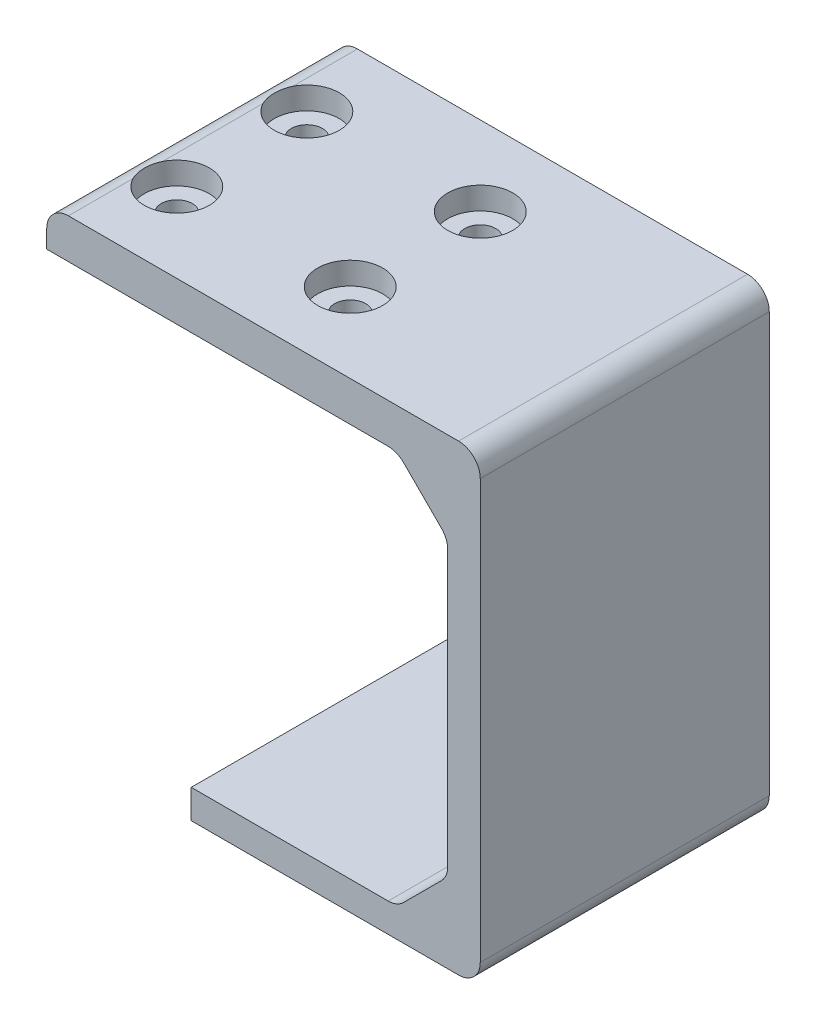
ISO-10303-21;
HEADER;
FILE_DESCRIPTION(('STEP AP214'),'2;1');
FILE_NAME('part.step','',(''),(''),'','','');
FILE_SCHEMA(('AUTOMOTIVE_DESIGN { 1 0 10303 214 1 1 1 1 }'));
ENDSEC;
DATA;
#1=APPLICATION_CONTEXT('core data for automotive mechanical design processes');
#2=APPLICATION_PROTOCOL_DEFINITION('international standard','automotive_design',2000,#1);
#3=PRODUCT_CONTEXT('',#1,'mechanical');
#4=PRODUCT('Part','Part','',(#3));
#5=PRODUCT_RELATED_PRODUCT_CATEGORY('part','',(#4));
#6=PRODUCT_DEFINITION_FORMATION('','',#4);
#7=PRODUCT_DEFINITION_CONTEXT('part definition',#1,'design');
#8=PRODUCT_DEFINITION('design','',#6,#7);
#9=PRODUCT_DEFINITION_SHAPE('','',#8);
#10=(LENGTH_UNIT() NAMED_UNIT(*) SI_UNIT(.MILLI.,.METRE.));
#11=(NAMED_UNIT(*) PLANE_ANGLE_UNIT() SI_UNIT($,.RADIAN.));
#12=(NAMED_UNIT(*) SI_UNIT($,.STERADIAN.) SOLID_ANGLE_UNIT());
#13=UNCERTAINTY_MEASURE_WITH_UNIT(LENGTH_MEASURE(1.E-05),#10,'distance_accuracy_value','');
#14=(GEOMETRIC_REPRESENTATION_CONTEXT(3) GLOBAL_UNCERTAINTY_ASSIGNED_CONTEXT((#13)) GLOBAL_UNIT_ASSIGNED_CONTEXT((#10,
#11,#12)) REPRESENTATION_CONTEXT('',''));
#15=CARTESIAN_POINT('',(0.,0.,0.));
#16=DIRECTION('',(0.,0.,1.));
#17=DIRECTION('',(1.,0.,0.));
#18=AXIS2_PLACEMENT_3D('',#15,#16,#17);
#19=CARTESIAN_POINT('',(0.,32.,40.));
#20=DIRECTION('',(0.,-1.,0.));
#21=DIRECTION('',(1.,0.,0.));
#22=AXIS2_PLACEMENT_3D('',#19,#20,#21);
#23=PLANE('',#22);
#24=CARTESIAN_POINT('',(-29.,32.,11.));
#25=DIRECTION('',(0.,1.,0.));
#26=DIRECTION('',(0.,0.,1.));
#27=AXIS2_PLACEMENT_3D('',#24,#25,#26);
#28=CIRCLE('',#27,4.5);
#29=CARTESIAN_POINT('',(-29.,32.,15.5));
#30=VERTEX_POINT('',#29);
#31=EDGE_CURVE('E514',#30,#30,#28,.T.);
#32=ORIENTED_EDGE('',*,*,#31,.F.);
#33=EDGE_LOOP('',(#32));
#34=FACE_BOUND('',#33,.T.);
#35=CARTESIAN_POINT('',(-29.,32.,29.));
#36=DIRECTION('',(0.,1.,0.));
#37=DIRECTION('',(0.,0.,1.));
#38=AXIS2_PLACEMENT_3D('',#35,#36,#37);
#39=CIRCLE('',#38,4.5);
#40=CARTESIAN_POINT('',(-29.,32.,33.5));
#41=VERTEX_POINT('',#40);
#42=EDGE_CURVE('E530',#41,#41,#39,.T.);
#43=ORIENTED_EDGE('',*,*,#42,.F.);
#44=EDGE_LOOP('',(#43));
#45=FACE_BOUND('',#44,.T.);
#46=CARTESIAN_POINT('',(-53.,32.,11.));
#47=DIRECTION('',(0.,1.,0.));
#48=DIRECTION('',(0.,0.,1.));
#49=AXIS2_PLACEMENT_3D('',#46,#47,#48);
#50=CIRCLE('',#49,4.5);
#51=CARTESIAN_POINT('',(-57.,32.,13.0615528128088));
#52=VERTEX_POINT('',#51);
#53=CARTESIAN_POINT('',(-57.,32.,8.93844718719117));
#54=VERTEX_POINT('',#53);
#55=EDGE_CURVE('E60',#52,#54,#50,.T.);
#56=ORIENTED_EDGE('',*,*,#55,.F.);
#57=DIRECTION('',(0.,0.,-1.));
#58=VECTOR('',#57,1.);
#59=CARTESIAN_POINT('',(-57.,32.,40.));
#60=LINE('',#59,#58);
#61=CARTESIAN_POINT('',(-57.,32.,26.9384471871912));
#62=VERTEX_POINT('',#61);
#63=EDGE_CURVE('E67',#52,#62,#60,.F.);
#64=ORIENTED_EDGE('',*,*,#63,.T.);
#65=CARTESIAN_POINT('',(-53.,32.,29.));
#66=DIRECTION('',(0.,1.,0.));
#67=DIRECTION('',(0.,0.,1.));
#68=AXIS2_PLACEMENT_3D('',#65,#66,#67);
#69=CIRCLE('',#68,4.5);
#70=CARTESIAN_POINT('',(-57.,32.,31.0615528128088));
#71=VERTEX_POINT('',#70);
#72=EDGE_CURVE('E546',#71,#62,#69,.T.);
#73=ORIENTED_EDGE('',*,*,#72,.F.);
#74=CARTESIAN_POINT('',(-57.,32.,40.));
#75=VERTEX_POINT('',#74);
#76=EDGE_CURVE('E189',#71,#75,#60,.F.);
#77=ORIENTED_EDGE('',*,*,#76,.T.);
#78=DIRECTION('',(-1.,0.,0.));
#79=VECTOR('',#78,1.);
#80=CARTESIAN_POINT('',(0.,32.,40.));
#81=LINE('',#80,#79);
#82=CARTESIAN_POINT('',(-3.00000000000001,32.,40.));
#83=VERTEX_POINT('',#82);
#84=EDGE_CURVE('E464',#83,#75,#81,.T.);
#85=ORIENTED_EDGE('',*,*,#84,.F.);
#86=DIRECTION('',(0.,0.,-1.));
#87=VECTOR('',#86,1.);
#88=CARTESIAN_POINT('',(-3.00000000000001,32.,40.));
#89=LINE('',#88,#87);
#90=CARTESIAN_POINT('',(-3.00000000000001,32.,0.));
#91=VERTEX_POINT('',#90);
#92=EDGE_CURVE('E194',#83,#91,#89,.T.);
#93=ORIENTED_EDGE('',*,*,#92,.T.);
#94=DIRECTION('',(-1.,0.,0.));
#95=VECTOR('',#94,1.);
#96=CARTESIAN_POINT('',(0.,32.,0.));
#97=LINE('',#96,#95);
#98=CARTESIAN_POINT('',(-57.,32.,0.));
#99=VERTEX_POINT('',#98);
#100=EDGE_CURVE('E387',#91,#99,#97,.T.);
#101=ORIENTED_EDGE('',*,*,#100,.T.);
#102=EDGE_CURVE('E181',#99,#54,#60,.F.);
#103=ORIENTED_EDGE('',*,*,#102,.T.);
#104=EDGE_LOOP('',(#56,#64,#73,#77,#85,#93,#101,#103));
#105=FACE_BOUND('',#104,.T.);
#106=ADVANCED_FACE('F40',(#34,#45,#105),#23,.F.);
#107=CARTESIAN_POINT('',(-40.,-32.,40.));
#108=DIRECTION('',(0.,1.,0.));
#109=DIRECTION('',(0.,0.,1.));
#110=AXIS2_PLACEMENT_3D('',#107,#108,#109);
#111=PLANE('',#110);
#112=DIRECTION('',(1.,0.,0.));
#113=VECTOR('',#112,1.);
#114=CARTESIAN_POINT('',(-40.,-32.,0.));
#115=LINE('',#114,#113);
#116=CARTESIAN_POINT('',(-40.,-32.,0.));
#117=VERTEX_POINT('',#116);
#118=CARTESIAN_POINT('',(-3.,-32.,0.));
#119=VERTEX_POINT('',#118);
#120=EDGE_CURVE('E472',#117,#119,#115,.T.);
#121=ORIENTED_EDGE('',*,*,#120,.T.);
#122=DIRECTION('',(0.,0.,-1.));
#123=VECTOR('',#122,1.);
#124=CARTESIAN_POINT('',(-3.,-32.,40.));
#125=LINE('',#124,#123);
#126=CARTESIAN_POINT('',(-3.,-32.,40.));
#127=VERTEX_POINT('',#126);
#128=EDGE_CURVE('E213',#119,#127,#125,.F.);
#129=ORIENTED_EDGE('',*,*,#128,.T.);
#130=DIRECTION('',(1.,0.,0.));
#131=VECTOR('',#130,1.);
#132=CARTESIAN_POINT('',(-40.,-32.,40.));
#133=LINE('',#132,#131);
#134=CARTESIAN_POINT('',(-40.,-32.,40.));
#135=VERTEX_POINT('',#134);
#136=EDGE_CURVE('E396',#135,#127,#133,.T.);
#137=ORIENTED_EDGE('',*,*,#136,.F.);
#138=DIRECTION('',(0.,0.,-1.));
#139=VECTOR('',#138,1.);
#140=CARTESIAN_POINT('',(-40.,-32.,40.));
#141=LINE('',#140,#139);
#142=EDGE_CURVE('E397',#135,#117,#141,.T.);
#143=ORIENTED_EDGE('',*,*,#142,.T.);
#144=EDGE_LOOP('',(#121,#129,#137,#143));
#145=FACE_BOUND('',#144,.T.);
#146=ADVANCED_FACE('F319',(#145),#111,.F.);
#147=CARTESIAN_POINT('',(0.,32.,40.));
#148=DIRECTION('',(-1.,0.,0.));
#149=DIRECTION('',(0.,-1.,0.));
#150=AXIS2_PLACEMENT_3D('',#147,#148,#149);
#151=PLANE('',#150);
#152=DIRECTION('',(0.,1.,0.));
#153=VECTOR('',#152,1.);
#154=CARTESIAN_POINT('',(0.,32.,40.));
#155=LINE('',#154,#153);
#156=CARTESIAN_POINT('',(0.,-29.,40.));
#157=VERTEX_POINT('',#156);
#158=CARTESIAN_POINT('',(0.,29.,40.));
#159=VERTEX_POINT('',#158);
#160=EDGE_CURVE('E496',#157,#159,#155,.T.);
#161=ORIENTED_EDGE('',*,*,#160,.F.);
#162=DIRECTION('',(0.,0.,-1.));
#163=VECTOR('',#162,1.);
#164=CARTESIAN_POINT('',(0.,-29.,40.));
#165=LINE('',#164,#163);
#166=CARTESIAN_POINT('',(0.,-29.,0.));
#167=VERTEX_POINT('',#166);
#168=EDGE_CURVE('E209',#157,#167,#165,.T.);
#169=ORIENTED_EDGE('',*,*,#168,.T.);
#170=DIRECTION('',(0.,1.,0.));
#171=VECTOR('',#170,1.);
#172=CARTESIAN_POINT('',(0.,32.,0.));
#173=LINE('',#172,#171);
#174=CARTESIAN_POINT('',(0.,29.,0.));
#175=VERTEX_POINT('',#174);
#176=EDGE_CURVE('E470',#167,#175,#173,.T.);
#177=ORIENTED_EDGE('',*,*,#176,.T.);
#178=DIRECTION('',(0.,0.,-1.));
#179=VECTOR('',#178,1.);
#180=CARTESIAN_POINT('',(0.,29.,40.));
#181=LINE('',#180,#179);
#182=EDGE_CURVE('E206',#175,#159,#181,.F.);
#183=ORIENTED_EDGE('',*,*,#182,.T.);
#184=EDGE_LOOP('',(#161,#169,#177,#183));
#185=FACE_BOUND('',#184,.T.);
#186=ADVANCED_FACE('F315',(#185),#151,.F.);
#187=CARTESIAN_POINT('',(-60.,32.,40.));
#188=DIRECTION('',(1.,0.,0.));
#189=DIRECTION('',(0.,0.,-1.));
#190=AXIS2_PLACEMENT_3D('',#187,#188,#189);
#191=PLANE('',#190);
#192=DIRECTION('',(0.,-1.,0.));
#193=VECTOR('',#192,1.);
#194=CARTESIAN_POINT('',(-60.,32.,40.));
#195=LINE('',#194,#193);
#196=CARTESIAN_POINT('',(-60.,29.,40.));
#197=VERTEX_POINT('',#196);
#198=CARTESIAN_POINT('',(-60.,26.5,40.));
#199=VERTEX_POINT('',#198);
#200=EDGE_CURVE('E491',#197,#199,#195,.T.);
#201=ORIENTED_EDGE('',*,*,#200,.F.);
#202=DIRECTION('',(0.,0.,-1.));
#203=VECTOR('',#202,1.);
#204=CARTESIAN_POINT('',(-60.,29.,40.));
#205=LINE('',#204,#203);
#206=CARTESIAN_POINT('',(-60.,29.,0.));
#207=VERTEX_POINT('',#206);
#208=EDGE_CURVE('E447',#197,#207,#205,.T.);
#209=ORIENTED_EDGE('',*,*,#208,.T.);
#210=DIRECTION('',(0.,-1.,0.));
#211=VECTOR('',#210,1.);
#212=CARTESIAN_POINT('',(-60.,32.,0.));
#213=LINE('',#212,#211);
#214=CARTESIAN_POINT('',(-60.,26.5,0.));
#215=VERTEX_POINT('',#214);
#216=EDGE_CURVE('E380',#207,#215,#213,.T.);
#217=ORIENTED_EDGE('',*,*,#216,.T.);
#218=DIRECTION('',(0.,0.,-1.));
#219=VECTOR('',#218,1.);
#220=CARTESIAN_POINT('',(-60.,26.5,40.));
#221=LINE('',#220,#219);
#222=EDGE_CURVE('E377',#199,#215,#221,.T.);
#223=ORIENTED_EDGE('',*,*,#222,.F.);
#224=EDGE_LOOP('',(#201,#209,#217,#223));
#225=FACE_BOUND('',#224,.T.);
#226=ADVANCED_FACE('F311',(#225),#191,.F.);
#227=CARTESIAN_POINT('',(-60.,26.5,40.));
#228=DIRECTION('',(0.,1.,0.));
#229=DIRECTION('',(0.,0.,1.));
#230=AXIS2_PLACEMENT_3D('',#227,#228,#229);
#231=PLANE('',#230);
#232=CARTESIAN_POINT('',(-53.,26.5,11.));
#233=DIRECTION('',(0.,1.,0.));
#234=DIRECTION('',(0.,0.,1.));
#235=AXIS2_PLACEMENT_3D('',#232,#233,#234);
#236=CIRCLE('',#235,2.15);
#237=CARTESIAN_POINT('',(-53.,26.5,13.15));
#238=VERTEX_POINT('',#237);
#239=EDGE_CURVE('E549',#238,#238,#236,.T.);
#240=ORIENTED_EDGE('',*,*,#239,.T.);
#241=EDGE_LOOP('',(#240));
#242=FACE_BOUND('',#241,.T.);
#243=CARTESIAN_POINT('',(-53.,26.5,29.));
#244=DIRECTION('',(0.,1.,0.));
#245=DIRECTION('',(0.,0.,1.));
#246=AXIS2_PLACEMENT_3D('',#243,#244,#245);
#247=CIRCLE('',#246,2.15);
#248=CARTESIAN_POINT('',(-53.,26.5,31.15));
#249=VERTEX_POINT('',#248);
#250=EDGE_CURVE('E534',#249,#249,#247,.T.);
#251=ORIENTED_EDGE('',*,*,#250,.T.);
#252=EDGE_LOOP('',(#251));
#253=FACE_BOUND('',#252,.T.);
#254=CARTESIAN_POINT('',(-29.,26.5,29.));
#255=DIRECTION('',(0.,1.,0.));
#256=DIRECTION('',(0.,0.,1.));
#257=AXIS2_PLACEMENT_3D('',#254,#255,#256);
#258=CIRCLE('',#257,2.15);
#259=CARTESIAN_POINT('',(-29.,26.5,31.15));
#260=VERTEX_POINT('',#259);
#261=EDGE_CURVE('E518',#260,#260,#258,.T.);
#262=ORIENTED_EDGE('',*,*,#261,.T.);
#263=EDGE_LOOP('',(#262));
#264=FACE_BOUND('',#263,.T.);
#265=CARTESIAN_POINT('',(-29.,26.5,11.));
#266=DIRECTION('',(0.,1.,0.));
#267=DIRECTION('',(0.,0.,1.));
#268=AXIS2_PLACEMENT_3D('',#265,#266,#267);
#269=CIRCLE('',#268,2.15);
#270=CARTESIAN_POINT('',(-29.,26.5,13.15));
#271=VERTEX_POINT('',#270);
#272=EDGE_CURVE('E478',#271,#271,#269,.T.);
#273=ORIENTED_EDGE('',*,*,#272,.T.);
#274=EDGE_LOOP('',(#273));
#275=FACE_BOUND('',#274,.T.);
#276=DIRECTION('',(1.,0.,0.));
#277=VECTOR('',#276,1.);
#278=CARTESIAN_POINT('',(-60.,26.5,0.));
#279=LINE('',#278,#277);
#280=CARTESIAN_POINT('',(-12.7426406871193,26.5,0.));
#281=VERTEX_POINT('',#280);
#282=EDGE_CURVE('E369',#215,#281,#279,.T.);
#283=ORIENTED_EDGE('',*,*,#282,.T.);
#284=DIRECTION('',(0.,0.,-1.));
#285=VECTOR('',#284,1.);
#286=CARTESIAN_POINT('',(-12.7426406871193,26.5,40.));
#287=LINE('',#286,#285);
#288=CARTESIAN_POINT('',(-12.7426406871193,26.5,40.));
#289=VERTEX_POINT('',#288);
#290=EDGE_CURVE('E364',#281,#289,#287,.F.);
#291=ORIENTED_EDGE('',*,*,#290,.T.);
#292=DIRECTION('',(1.,0.,0.));
#293=VECTOR('',#292,1.);
#294=CARTESIAN_POINT('',(-60.,26.5,40.));
#295=LINE('',#294,#293);
#296=EDGE_CURVE('E488',#199,#289,#295,.T.);
#297=ORIENTED_EDGE('',*,*,#296,.F.);
#298=ORIENTED_EDGE('',*,*,#222,.T.);
#299=EDGE_LOOP('',(#283,#291,#297,#298));
#300=FACE_BOUND('',#299,.T.);
#301=ADVANCED_FACE('F307',(#242,#253,#264,#275,#300),#231,.F.);
#302=CARTESIAN_POINT('',(-4.5,26.5,40.));
#303=DIRECTION('',(1.,0.,0.));
#304=DIRECTION('',(0.,1.,0.));
#305=AXIS2_PLACEMENT_3D('',#302,#303,#304);
#306=PLANE('',#305);
#307=DIRECTION('',(0.,-1.,0.));
#308=VECTOR('',#307,1.);
#309=CARTESIAN_POINT('',(-4.5,26.5,0.));
#310=LINE('',#309,#308);
#311=CARTESIAN_POINT('',(-4.5,18.2573593128806,0.));
#312=VERTEX_POINT('',#311);
#313=CARTESIAN_POINT('',(-4.49999999999999,-19.7573593128807,0.));
#314=VERTEX_POINT('',#313);
#315=EDGE_CURVE('E379',#312,#314,#310,.T.);
#316=ORIENTED_EDGE('',*,*,#315,.T.);
#317=DIRECTION('',(0.,0.,-1.));
#318=VECTOR('',#317,1.);
#319=CARTESIAN_POINT('',(-4.49999999999999,-19.7573593128807,40.));
#320=LINE('',#319,#318);
#321=CARTESIAN_POINT('',(-4.49999999999999,-19.7573593128807,40.));
#322=VERTEX_POINT('',#321);
#323=EDGE_CURVE('E436',#314,#322,#320,.F.);
#324=ORIENTED_EDGE('',*,*,#323,.T.);
#325=DIRECTION('',(0.,-1.,0.));
#326=VECTOR('',#325,1.);
#327=CARTESIAN_POINT('',(-4.5,26.5,40.));
#328=LINE('',#327,#326);
#329=CARTESIAN_POINT('',(-4.5,18.2573593128806,40.));
#330=VERTEX_POINT('',#329);
#331=EDGE_CURVE('E484',#330,#322,#328,.T.);
#332=ORIENTED_EDGE('',*,*,#331,.F.);
#333=DIRECTION('',(0.,0.,1.));
#334=VECTOR('',#333,1.);
#335=CARTESIAN_POINT('',(-4.5,18.2573593128806,0.));
#336=LINE('',#335,#334);
#337=EDGE_CURVE('E432',#330,#312,#336,.F.);
#338=ORIENTED_EDGE('',*,*,#337,.T.);
#339=EDGE_LOOP('',(#316,#324,#332,#338));
#340=FACE_BOUND('',#339,.T.);
#341=ADVANCED_FACE('F303',(#340),#306,.F.);
#342=CARTESIAN_POINT('',(-4.49999999999999,-28.,40.));
#343=DIRECTION('',(0.,-1.,0.));
#344=DIRECTION('',(1.,0.,0.));
#345=AXIS2_PLACEMENT_3D('',#342,#343,#344);
#346=PLANE('',#345);
#347=DIRECTION('',(-1.,0.,0.));
#348=VECTOR('',#347,1.);
#349=CARTESIAN_POINT('',(-4.49999999999999,-28.,40.));
#350=LINE('',#349,#348);
#351=CARTESIAN_POINT('',(-12.7426406871193,-28.,40.));
#352=VERTEX_POINT('',#351);
#353=CARTESIAN_POINT('',(-40.,-28.,40.));
#354=VERTEX_POINT('',#353);
#355=EDGE_CURVE('E481',#352,#354,#350,.T.);
#356=ORIENTED_EDGE('',*,*,#355,.F.);
#357=DIRECTION('',(0.,0.,1.));
#358=VECTOR('',#357,1.);
#359=CARTESIAN_POINT('',(-12.7426406871193,-28.,0.));
#360=LINE('',#359,#358);
#361=CARTESIAN_POINT('',(-12.7426406871193,-28.,0.));
#362=VERTEX_POINT('',#361);
#363=EDGE_CURVE('E422',#352,#362,#360,.F.);
#364=ORIENTED_EDGE('',*,*,#363,.T.);
#365=DIRECTION('',(-1.,0.,0.));
#366=VECTOR('',#365,1.);
#367=CARTESIAN_POINT('',(-4.49999999999999,-28.,0.));
#368=LINE('',#367,#366);
#369=CARTESIAN_POINT('',(-40.,-28.,0.));
#370=VERTEX_POINT('',#369);
#371=EDGE_CURVE('E385',#362,#370,#368,.T.);
#372=ORIENTED_EDGE('',*,*,#371,.T.);
#373=DIRECTION('',(0.,0.,-1.));
#374=VECTOR('',#373,1.);
#375=CARTESIAN_POINT('',(-40.,-28.,40.));
#376=LINE('',#375,#374);
#377=EDGE_CURVE('E401',#354,#370,#376,.T.);
#378=ORIENTED_EDGE('',*,*,#377,.F.);
#379=EDGE_LOOP('',(#356,#364,#372,#378));
#380=FACE_BOUND('',#379,.T.);
#381=ADVANCED_FACE('F299',(#380),#346,.F.);
#382=CARTESIAN_POINT('',(-40.,-28.,40.));
#383=DIRECTION('',(1.,0.,0.));
#384=DIRECTION('',(0.,1.,0.));
#385=AXIS2_PLACEMENT_3D('',#382,#383,#384);
#386=PLANE('',#385);
#387=DIRECTION('',(0.,-1.,0.));
#388=VECTOR('',#387,1.);
#389=CARTESIAN_POINT('',(-40.,-28.,0.));
#390=LINE('',#389,#388);
#391=EDGE_CURVE('E393',#370,#117,#390,.T.);
#392=ORIENTED_EDGE('',*,*,#391,.T.);
#393=ORIENTED_EDGE('',*,*,#142,.F.);
#394=DIRECTION('',(0.,-1.,0.));
#395=VECTOR('',#394,1.);
#396=CARTESIAN_POINT('',(-40.,-28.,40.));
#397=LINE('',#396,#395);
#398=EDGE_CURVE('E402',#354,#135,#397,.T.);
#399=ORIENTED_EDGE('',*,*,#398,.F.);
#400=ORIENTED_EDGE('',*,*,#377,.T.);
#401=EDGE_LOOP('',(#392,#393,#399,#400));
#402=FACE_BOUND('',#401,.T.);
#403=ADVANCED_FACE('F291',(#402),#386,.F.);
#404=CARTESIAN_POINT('',(0.,0.,40.));
#405=DIRECTION('',(0.,0.,-1.));
#406=DIRECTION('',(-1.,0.,0.));
#407=AXIS2_PLACEMENT_3D('',#404,#405,#406);
#408=PLANE('',#407);
#409=ORIENTED_EDGE('',*,*,#84,.T.);
#410=CARTESIAN_POINT('',(-57.,29.,40.));
#411=DIRECTION('',(0.,0.,-1.));
#412=DIRECTION('',(-1.,0.,0.));
#413=AXIS2_PLACEMENT_3D('',#410,#411,#412);
#414=CIRCLE('',#413,3.);
#415=EDGE_CURVE('E203',#75,#197,#414,.F.);
#416=ORIENTED_EDGE('',*,*,#415,.T.);
#417=ORIENTED_EDGE('',*,*,#200,.T.);
#418=ORIENTED_EDGE('',*,*,#296,.T.);
#419=CARTESIAN_POINT('',(-12.7426406871193,23.5,40.));
#420=DIRECTION('',(0.,0.,-1.));
#421=DIRECTION('',(-1.,0.,0.));
#422=AXIS2_PLACEMENT_3D('',#419,#420,#421);
#423=CIRCLE('',#422,3.);
#424=CARTESIAN_POINT('',(-10.6213203435596,25.6213203435596,40.));
#425=VERTEX_POINT('',#424);
#426=EDGE_CURVE('E234',#289,#425,#423,.T.);
#427=ORIENTED_EDGE('',*,*,#426,.T.);
#428=DIRECTION('',(-0.707106781186544,0.707106781186551,0.));
#429=VECTOR('',#428,1.);
#430=CARTESIAN_POINT('',(7.49999999999993,7.49999999999986,40.));
#431=LINE('',#430,#429);
#432=CARTESIAN_POINT('',(-5.37867965644034,20.3786796564403,40.));
#433=VERTEX_POINT('',#432);
#434=EDGE_CURVE('E418',#425,#433,#431,.F.);
#435=ORIENTED_EDGE('',*,*,#434,.T.);
#436=CARTESIAN_POINT('',(-7.5,18.2573593128806,40.));
#437=DIRECTION('',(0.,0.,-1.));
#438=DIRECTION('',(-1.,0.,0.));
#439=AXIS2_PLACEMENT_3D('',#436,#437,#438);
#440=CIRCLE('',#439,3.);
#441=EDGE_CURVE('E231',#433,#330,#440,.T.);
#442=ORIENTED_EDGE('',*,*,#441,.T.);
#443=ORIENTED_EDGE('',*,*,#331,.T.);
#444=CARTESIAN_POINT('',(-7.49999999999999,-19.7573593128807,40.));
#445=DIRECTION('',(0.,0.,-1.));
#446=DIRECTION('',(-1.,0.,0.));
#447=AXIS2_PLACEMENT_3D('',#444,#445,#446);
#448=CIRCLE('',#447,3.);
#449=CARTESIAN_POINT('',(-5.37867965644036,-21.8786796564404,40.));
#450=VERTEX_POINT('',#449);
#451=EDGE_CURVE('E222',#322,#450,#448,.T.);
#452=ORIENTED_EDGE('',*,*,#451,.T.);
#453=DIRECTION('',(0.707106781186552,0.707106781186543,0.));
#454=VECTOR('',#453,1.);
#455=CARTESIAN_POINT('',(8.25000000000004,-8.25000000000013,40.));
#456=LINE('',#455,#454);
#457=CARTESIAN_POINT('',(-10.6213203435597,-27.1213203435596,40.));
#458=VERTEX_POINT('',#457);
#459=EDGE_CURVE('E412',#450,#458,#456,.F.);
#460=ORIENTED_EDGE('',*,*,#459,.T.);
#461=CARTESIAN_POINT('',(-12.7426406871193,-25.,40.));
#462=DIRECTION('',(0.,0.,-1.));
#463=DIRECTION('',(-1.,0.,0.));
#464=AXIS2_PLACEMENT_3D('',#461,#462,#463);
#465=CIRCLE('',#464,3.);
#466=EDGE_CURVE('E219',#458,#352,#465,.T.);
#467=ORIENTED_EDGE('',*,*,#466,.T.);
#468=ORIENTED_EDGE('',*,*,#355,.T.);
#469=ORIENTED_EDGE('',*,*,#398,.T.);
#470=ORIENTED_EDGE('',*,*,#136,.T.);
#471=CARTESIAN_POINT('',(-2.99999999999999,-29.,40.));
#472=DIRECTION('',(0.,0.,-1.));
#473=DIRECTION('',(-1.,0.,0.));
#474=AXIS2_PLACEMENT_3D('',#471,#472,#473);
#475=CIRCLE('',#474,3.);
#476=EDGE_CURVE('E200',#127,#157,#475,.F.);
#477=ORIENTED_EDGE('',*,*,#476,.T.);
#478=ORIENTED_EDGE('',*,*,#160,.T.);
#479=CARTESIAN_POINT('',(-3.00000000000001,29.,40.));
#480=DIRECTION('',(0.,0.,-1.));
#481=DIRECTION('',(-1.,0.,0.));
#482=AXIS2_PLACEMENT_3D('',#479,#480,#481);
#483=CIRCLE('',#482,3.);
#484=EDGE_CURVE('E193',#159,#83,#483,.F.);
#485=ORIENTED_EDGE('',*,*,#484,.T.);
#486=EDGE_LOOP('',(#409,#416,#417,#418,#427,#435,#442,#443,#452,#460,#467,#468,#469,#470,#477,
#478,#485));
#487=FACE_BOUND('',#486,.T.);
#488=ADVANCED_FACE('F287',(#487),#408,.F.);
#489=CARTESIAN_POINT('',(0.,0.,0.));
#490=DIRECTION('',(0.,0.,-1.));
#491=DIRECTION('',(-1.,0.,0.));
#492=AXIS2_PLACEMENT_3D('',#489,#490,#491);
#493=PLANE('',#492);
#494=ORIENTED_EDGE('',*,*,#216,.F.);
#495=CARTESIAN_POINT('',(-57.,29.,0.));
#496=DIRECTION('',(0.,0.,-1.));
#497=DIRECTION('',(-1.,0.,0.));
#498=AXIS2_PLACEMENT_3D('',#495,#496,#497);
#499=CIRCLE('',#498,3.);
#500=EDGE_CURVE('E456',#207,#99,#499,.T.);
#501=ORIENTED_EDGE('',*,*,#500,.T.);
#502=ORIENTED_EDGE('',*,*,#100,.F.);
#503=CARTESIAN_POINT('',(-3.00000000000001,29.,0.));
#504=DIRECTION('',(0.,0.,-1.));
#505=DIRECTION('',(-1.,0.,0.));
#506=AXIS2_PLACEMENT_3D('',#503,#504,#505);
#507=CIRCLE('',#506,3.);
#508=EDGE_CURVE('E451',#91,#175,#507,.T.);
#509=ORIENTED_EDGE('',*,*,#508,.T.);
#510=ORIENTED_EDGE('',*,*,#176,.F.);
#511=CARTESIAN_POINT('',(-2.99999999999999,-29.,0.));
#512=DIRECTION('',(0.,0.,-1.));
#513=DIRECTION('',(-1.,0.,0.));
#514=AXIS2_PLACEMENT_3D('',#511,#512,#513);
#515=CIRCLE('',#514,3.);
#516=EDGE_CURVE('E454',#167,#119,#515,.T.);
#517=ORIENTED_EDGE('',*,*,#516,.T.);
#518=ORIENTED_EDGE('',*,*,#120,.F.);
#519=ORIENTED_EDGE('',*,*,#391,.F.);
#520=ORIENTED_EDGE('',*,*,#371,.F.);
#521=CARTESIAN_POINT('',(-12.7426406871193,-25.,0.));
#522=DIRECTION('',(0.,0.,-1.));
#523=DIRECTION('',(-1.,0.,0.));
#524=AXIS2_PLACEMENT_3D('',#521,#522,#523);
#525=CIRCLE('',#524,3.);
#526=CARTESIAN_POINT('',(-10.6213203435597,-27.1213203435597,0.));
#527=VERTEX_POINT('',#526);
#528=EDGE_CURVE('E216',#362,#527,#525,.F.);
#529=ORIENTED_EDGE('',*,*,#528,.T.);
#530=DIRECTION('',(-0.707106781186552,-0.707106781186543,0.));
#531=VECTOR('',#530,1.);
#532=CARTESIAN_POINT('',(-11.5000000000001,-28.,0.));
#533=LINE('',#532,#531);
#534=CARTESIAN_POINT('',(-5.37867965644036,-21.8786796564404,0.));
#535=VERTEX_POINT('',#534);
#536=EDGE_CURVE('E408',#527,#535,#533,.F.);
#537=ORIENTED_EDGE('',*,*,#536,.T.);
#538=CARTESIAN_POINT('',(-7.49999999999999,-19.7573593128807,0.));
#539=DIRECTION('',(0.,0.,-1.));
#540=DIRECTION('',(-1.,0.,0.));
#541=AXIS2_PLACEMENT_3D('',#538,#539,#540);
#542=CIRCLE('',#541,3.);
#543=EDGE_CURVE('E225',#535,#314,#542,.F.);
#544=ORIENTED_EDGE('',*,*,#543,.T.);
#545=ORIENTED_EDGE('',*,*,#315,.F.);
#546=CARTESIAN_POINT('',(-7.5,18.2573593128806,0.));
#547=DIRECTION('',(0.,0.,-1.));
#548=DIRECTION('',(-1.,0.,0.));
#549=AXIS2_PLACEMENT_3D('',#546,#547,#548);
#550=CIRCLE('',#549,3.);
#551=CARTESIAN_POINT('',(-5.37867965644034,20.3786796564403,0.));
#552=VERTEX_POINT('',#551);
#553=EDGE_CURVE('E228',#312,#552,#550,.F.);
#554=ORIENTED_EDGE('',*,*,#553,.T.);
#555=DIRECTION('',(0.707106781186544,-0.707106781186551,0.));
#556=VECTOR('',#555,1.);
#557=CARTESIAN_POINT('',(-4.5,19.4999999999999,0.));
#558=LINE('',#557,#556);
#559=CARTESIAN_POINT('',(-10.6213203435596,25.6213203435596,0.));
#560=VERTEX_POINT('',#559);
#561=EDGE_CURVE('E371',#552,#560,#558,.F.);
#562=ORIENTED_EDGE('',*,*,#561,.T.);
#563=CARTESIAN_POINT('',(-12.7426406871193,23.5,0.));
#564=DIRECTION('',(0.,0.,-1.));
#565=DIRECTION('',(-1.,0.,0.));
#566=AXIS2_PLACEMENT_3D('',#563,#564,#565);
#567=CIRCLE('',#566,3.);
#568=EDGE_CURVE('E237',#560,#281,#567,.F.);
#569=ORIENTED_EDGE('',*,*,#568,.T.);
#570=ORIENTED_EDGE('',*,*,#282,.F.);
#571=EDGE_LOOP('',(#494,#501,#502,#509,#510,#517,#518,#519,#520,#529,#537,#544,#545,#554,#562,
#569,#570));
#572=FACE_BOUND('',#571,.T.);
#573=ADVANCED_FACE('F290',(#572),#493,.T.);
#574=CARTESIAN_POINT('',(-11.5000000000001,-28.,40.));
#575=DIRECTION('',(-0.707106781186543,0.707106781186552,0.));
#576=DIRECTION('',(0.,0.,1.));
#577=AXIS2_PLACEMENT_3D('',#574,#575,#576);
#578=PLANE('',#577);
#579=ORIENTED_EDGE('',*,*,#536,.F.);
#580=DIRECTION('',(0.,0.,-1.));
#581=VECTOR('',#580,1.);
#582=CARTESIAN_POINT('',(-10.6213203435597,-27.1213203435597,40.));
#583=LINE('',#582,#581);
#584=EDGE_CURVE('E429',#527,#458,#583,.F.);
#585=ORIENTED_EDGE('',*,*,#584,.T.);
#586=ORIENTED_EDGE('',*,*,#459,.F.);
#587=DIRECTION('',(0.,0.,1.));
#588=VECTOR('',#587,1.);
#589=CARTESIAN_POINT('',(-5.37867965644036,-21.8786796564404,0.));
#590=LINE('',#589,#588);
#591=EDGE_CURVE('E426',#450,#535,#590,.F.);
#592=ORIENTED_EDGE('',*,*,#591,.T.);
#593=EDGE_LOOP('',(#579,#585,#586,#592));
#594=FACE_BOUND('',#593,.T.);
#595=ADVANCED_FACE('F295',(#594),#578,.T.);
#596=CARTESIAN_POINT('',(-4.5,19.4999999999999,40.));
#597=DIRECTION('',(-0.707106781186551,-0.707106781186544,0.));
#598=DIRECTION('',(0.,0.,1.));
#599=AXIS2_PLACEMENT_3D('',#596,#597,#598);
#600=PLANE('',#599);
#601=ORIENTED_EDGE('',*,*,#561,.F.);
#602=DIRECTION('',(0.,0.,-1.));
#603=VECTOR('',#602,1.);
#604=CARTESIAN_POINT('',(-5.37867965644034,20.3786796564403,40.));
#605=LINE('',#604,#603);
#606=EDGE_CURVE('E442',#552,#433,#605,.F.);
#607=ORIENTED_EDGE('',*,*,#606,.T.);
#608=ORIENTED_EDGE('',*,*,#434,.F.);
#609=DIRECTION('',(0.,0.,1.));
#610=VECTOR('',#609,1.);
#611=CARTESIAN_POINT('',(-10.6213203435596,25.6213203435596,0.));
#612=LINE('',#611,#610);
#613=EDGE_CURVE('E362',#425,#560,#612,.F.);
#614=ORIENTED_EDGE('',*,*,#613,.T.);
#615=EDGE_LOOP('',(#601,#607,#608,#614));
#616=FACE_BOUND('',#615,.T.);
#617=ADVANCED_FACE('F333',(#616),#600,.T.);
#618=CARTESIAN_POINT('',(-12.7426406871193,-25.,40.));
#619=DIRECTION('',(0.,0.,-1.));
#620=DIRECTION('',(-1.,0.,0.));
#621=AXIS2_PLACEMENT_3D('',#618,#619,#620);
#622=CYLINDRICAL_SURFACE('',#621,3.);
#623=ORIENTED_EDGE('',*,*,#466,.F.);
#624=ORIENTED_EDGE('',*,*,#584,.F.);
#625=ORIENTED_EDGE('',*,*,#528,.F.);
#626=ORIENTED_EDGE('',*,*,#363,.F.);
#627=EDGE_LOOP('',(#623,#624,#625,#626));
#628=FACE_BOUND('',#627,.T.);
#629=ADVANCED_FACE('F339',(#628),#622,.F.);
#630=CARTESIAN_POINT('',(-7.49999999999999,-19.7573593128807,40.));
#631=DIRECTION('',(0.,0.,1.));
#632=DIRECTION('',(1.,0.,0.));
#633=AXIS2_PLACEMENT_3D('',#630,#631,#632);
#634=CYLINDRICAL_SURFACE('',#633,3.);
#635=ORIENTED_EDGE('',*,*,#543,.F.);
#636=ORIENTED_EDGE('',*,*,#591,.F.);
#637=ORIENTED_EDGE('',*,*,#451,.F.);
#638=ORIENTED_EDGE('',*,*,#323,.F.);
#639=EDGE_LOOP('',(#635,#636,#637,#638));
#640=FACE_BOUND('',#639,.T.);
#641=ADVANCED_FACE('F343',(#640),#634,.F.);
#642=CARTESIAN_POINT('',(-7.5,18.2573593128806,40.));
#643=DIRECTION('',(0.,0.,-1.));
#644=DIRECTION('',(-1.,0.,0.));
#645=AXIS2_PLACEMENT_3D('',#642,#643,#644);
#646=CYLINDRICAL_SURFACE('',#645,3.);
#647=ORIENTED_EDGE('',*,*,#441,.F.);
#648=ORIENTED_EDGE('',*,*,#606,.F.);
#649=ORIENTED_EDGE('',*,*,#553,.F.);
#650=ORIENTED_EDGE('',*,*,#337,.F.);
#651=EDGE_LOOP('',(#647,#648,#649,#650));
#652=FACE_BOUND('',#651,.T.);
#653=ADVANCED_FACE('F347',(#652),#646,.F.);
#654=CARTESIAN_POINT('',(-12.7426406871193,23.5,40.));
#655=DIRECTION('',(0.,0.,1.));
#656=DIRECTION('',(1.,0.,0.));
#657=AXIS2_PLACEMENT_3D('',#654,#655,#656);
#658=CYLINDRICAL_SURFACE('',#657,3.);
#659=ORIENTED_EDGE('',*,*,#568,.F.);
#660=ORIENTED_EDGE('',*,*,#613,.F.);
#661=ORIENTED_EDGE('',*,*,#426,.F.);
#662=ORIENTED_EDGE('',*,*,#290,.F.);
#663=EDGE_LOOP('',(#659,#660,#661,#662));
#664=FACE_BOUND('',#663,.T.);
#665=ADVANCED_FACE('F350',(#664),#658,.F.);
#666=CARTESIAN_POINT('',(-57.,29.,40.));
#667=DIRECTION('',(0.,0.,-1.));
#668=DIRECTION('',(-1.,0.,0.));
#669=AXIS2_PLACEMENT_3D('',#666,#667,#668);
#670=CYLINDRICAL_SURFACE('',#669,3.);
#671=CARTESIAN_POINT('',(-57.,32.,8.93844718719117));
#672=CARTESIAN_POINT('',(-57.0584649948789,31.9999576723663,9.05185727147341));
#673=CARTESIAN_POINT('',(-57.1120707099037,31.9982894838896,9.16774037405559));
#674=CARTESIAN_POINT('',(-57.2092415143362,31.9931008756191,9.40359182725148));
#675=CARTESIAN_POINT('',(-57.2528076809249,31.9895806546699,9.52355973800392));
#676=CARTESIAN_POINT('',(-57.3295357899126,31.9820921537618,9.76657300438163));
#677=CARTESIAN_POINT('',(-57.3627123394214,31.9781245136234,9.88961377440448));
#678=CARTESIAN_POINT('',(-57.4185183800755,31.970797957895,10.1380812159077));
#679=CARTESIAN_POINT('',(-57.4411481739451,31.967439024835,10.2635078187998));
#680=CARTESIAN_POINT('',(-57.4755099470125,31.9621257093135,10.5145225592235));
#681=CARTESIAN_POINT('',(-57.4873546998491,31.9601568416881,10.6400949457928));
#682=CARTESIAN_POINT('',(-57.5004641454363,31.9579690381145,10.8918106147001));
#683=CARTESIAN_POINT('',(-57.5017286116298,31.9577501396388,11.0179539092051));
#684=CARTESIAN_POINT('',(-57.4936688378527,31.959105775304,11.2698389457463));
#685=CARTESIAN_POINT('',(-57.4843488488429,31.960679589451,11.3955808286656));
#686=CARTESIAN_POINT('',(-57.4551991010747,31.9653013125967,11.6458040433507));
#687=CARTESIAN_POINT('',(-57.4353704143005,31.9683490712367,11.7702855023716));
#688=CARTESIAN_POINT('',(-57.3898134607146,31.9746378945502,11.9951128560182));
#689=CARTESIAN_POINT('',(-57.3657659765346,31.9777477482577,12.0958070617117));
#690=CARTESIAN_POINT('',(-57.3107929290121,31.9839858962701,12.2952859015635));
#691=CARTESIAN_POINT('',(-57.2798684800034,31.9871141875074,12.3940708422809));
#692=CARTESIAN_POINT('',(-57.2112738541086,31.9927502932984,12.5893000467105));
#693=CARTESIAN_POINT('',(-57.1736030893628,31.995258053735,12.6857441056109));
#694=CARTESIAN_POINT('',(-57.0916871539367,31.9988741666527,12.8758534575919));
#695=CARTESIAN_POINT('',(-57.0474402646208,31.9999821525889,12.9695180165649));
#696=CARTESIAN_POINT('',(-57.,32.,13.0615528128088));
#697=B_SPLINE_CURVE_WITH_KNOTS('',3,(#671,#672,#673,#674,#675,#676,#677,#678,#679,#680,#681,
#682,#683,#684,#685,#686,#687,#688,#689,#690,#691,#692,#693,#694,#695,#696),.UNSPECIFIED.,.F.,
.F.,(4,2,2,2,2,2,2,2,2,2,2,2,4),(0.,0.382616160676866,0.76519124988667,1.14722602380921,
1.5292498314801,1.90723153917119,2.28522134061693,2.66305938633108,3.0408588964937,
3.35133998954683,3.66177080928961,3.97222869249128,4.28276785537318),.UNSPECIFIED.);
#698=EDGE_CURVE('E11',#54,#52,#697,.T.);
#699=ORIENTED_EDGE('',*,*,#698,.F.);
#700=ORIENTED_EDGE('',*,*,#102,.F.);
#701=ORIENTED_EDGE('',*,*,#500,.F.);
#702=ORIENTED_EDGE('',*,*,#208,.F.);
#703=ORIENTED_EDGE('',*,*,#415,.F.);
#704=ORIENTED_EDGE('',*,*,#76,.F.);
#705=CARTESIAN_POINT('',(-57.,32.,26.9384471871912));
#706=CARTESIAN_POINT('',(-57.0584649948789,31.9999576723663,27.0518572714734));
#707=CARTESIAN_POINT('',(-57.1120707099037,31.9982894838896,27.1677403740556));
#708=CARTESIAN_POINT('',(-57.2092415143362,31.9931008756191,27.4035918272515));
#709=CARTESIAN_POINT('',(-57.2528076809249,31.9895806546699,27.5235597380039));
#710=CARTESIAN_POINT('',(-57.3295357899126,31.9820921537618,27.7665730043816));
#711=CARTESIAN_POINT('',(-57.3627123394214,31.9781245136234,27.8896137744045));
#712=CARTESIAN_POINT('',(-57.4185183800755,31.970797957895,28.1380812159077));
#713=CARTESIAN_POINT('',(-57.4411481739451,31.967439024835,28.2635078187998));
#714=CARTESIAN_POINT('',(-57.4755099470125,31.9621257093135,28.5145225592235));
#715=CARTESIAN_POINT('',(-57.4873546998491,31.9601568416881,28.6400949457928));
#716=CARTESIAN_POINT('',(-57.5004641454363,31.9579690381145,28.8918106147001));
#717=CARTESIAN_POINT('',(-57.5017286116298,31.9577501396388,29.0179539092051));
#718=CARTESIAN_POINT('',(-57.4936688378527,31.959105775304,29.2698389457463));
#719=CARTESIAN_POINT('',(-57.4843488488429,31.960679589451,29.3955808286656));
#720=CARTESIAN_POINT('',(-57.4551991010747,31.9653013125967,29.6458040433507));
#721=CARTESIAN_POINT('',(-57.4353704143005,31.9683490712367,29.7702855023716));
#722=CARTESIAN_POINT('',(-57.3898134607146,31.9746378945502,29.9951128560182));
#723=CARTESIAN_POINT('',(-57.3657659765346,31.9777477482577,30.0958070617117));
#724=CARTESIAN_POINT('',(-57.3107929290121,31.9839858962701,30.2952859015635));
#725=CARTESIAN_POINT('',(-57.2798684800034,31.9871141875074,30.3940708422809));
#726=CARTESIAN_POINT('',(-57.2112738541086,31.9927502932984,30.5893000467105));
#727=CARTESIAN_POINT('',(-57.1736030893628,31.995258053735,30.6857441056109));
#728=CARTESIAN_POINT('',(-57.0916871539367,31.9988741666527,30.8758534575919));
#729=CARTESIAN_POINT('',(-57.0474402646208,31.9999821525889,30.9695180165649));
#730=CARTESIAN_POINT('',(-57.,32.,31.0615528128088));
#731=B_SPLINE_CURVE_WITH_KNOTS('',3,(#705,#706,#707,#708,#709,#710,#711,#712,#713,#714,#715,
#716,#717,#718,#719,#720,#721,#722,#723,#724,#725,#726,#727,#728,#729,#730),.UNSPECIFIED.,.F.,
.F.,(4,2,2,2,2,2,2,2,2,2,2,2,4),(0.,0.382616160676863,0.76519124988667,1.14722602380921,
1.5292498314801,1.90723153917118,2.28522134061693,2.66305938633107,3.0408588964937,
3.35133998954683,3.66177080928961,3.97222869249128,4.28276785537318),.UNSPECIFIED.);
#732=EDGE_CURVE('E55',#62,#71,#731,.T.);
#733=ORIENTED_EDGE('',*,*,#732,.F.);
#734=ORIENTED_EDGE('',*,*,#63,.F.);
#735=EDGE_LOOP('',(#699,#700,#701,#702,#703,#704,#733,#734));
#736=FACE_BOUND('',#735,.T.);
#737=ADVANCED_FACE('F186',(#736),#670,.T.);
#738=CARTESIAN_POINT('',(-2.99999999999999,-29.,40.));
#739=DIRECTION('',(0.,0.,-1.));
#740=DIRECTION('',(-1.,0.,0.));
#741=AXIS2_PLACEMENT_3D('',#738,#739,#740);
#742=CYLINDRICAL_SURFACE('',#741,3.);
#743=ORIENTED_EDGE('',*,*,#476,.F.);
#744=ORIENTED_EDGE('',*,*,#128,.F.);
#745=ORIENTED_EDGE('',*,*,#516,.F.);
#746=ORIENTED_EDGE('',*,*,#168,.F.);
#747=EDGE_LOOP('',(#743,#744,#745,#746));
#748=FACE_BOUND('',#747,.T.);
#749=ADVANCED_FACE('F358',(#748),#742,.T.);
#750=CARTESIAN_POINT('',(-3.00000000000001,29.,40.));
#751=DIRECTION('',(0.,0.,-1.));
#752=DIRECTION('',(-1.,0.,0.));
#753=AXIS2_PLACEMENT_3D('',#750,#751,#752);
#754=CYLINDRICAL_SURFACE('',#753,3.);
#755=ORIENTED_EDGE('',*,*,#484,.F.);
#756=ORIENTED_EDGE('',*,*,#182,.F.);
#757=ORIENTED_EDGE('',*,*,#508,.F.);
#758=ORIENTED_EDGE('',*,*,#92,.F.);
#759=EDGE_LOOP('',(#755,#756,#757,#758));
#760=FACE_BOUND('',#759,.T.);
#761=ADVANCED_FACE('F42',(#760),#754,.T.);
#762=CARTESIAN_POINT('',(-29.,32.,11.));
#763=DIRECTION('',(0.,1.,0.));
#764=DIRECTION('',(0.,0.,1.));
#765=AXIS2_PLACEMENT_3D('',#762,#763,#764);
#766=CYLINDRICAL_SURFACE('',#765,2.15);
#767=ORIENTED_EDGE('',*,*,#272,.F.);
#768=EDGE_LOOP('',(#767));
#769=FACE_BOUND('',#768,.T.);
#770=CARTESIAN_POINT('',(-29.,28.9,11.));
#771=DIRECTION('',(0.,1.,0.));
#772=DIRECTION('',(0.,0.,1.));
#773=AXIS2_PLACEMENT_3D('',#770,#771,#772);
#774=CIRCLE('',#773,2.15);
#775=CARTESIAN_POINT('',(-29.,28.9,13.15));
#776=VERTEX_POINT('',#775);
#777=EDGE_CURVE('E506',#776,#776,#774,.T.);
#778=ORIENTED_EDGE('',*,*,#777,.T.);
#779=EDGE_LOOP('',(#778));
#780=FACE_BOUND('',#779,.T.);
#781=ADVANCED_FACE('F282',(#769,#780),#766,.F.);
#782=CARTESIAN_POINT('',(-26.85,28.9,11.));
#783=DIRECTION('',(0.,-1.,0.));
#784=DIRECTION('',(0.,0.,-1.));
#785=AXIS2_PLACEMENT_3D('',#782,#783,#784);
#786=PLANE('',#785);
#787=ORIENTED_EDGE('',*,*,#777,.F.);
#788=EDGE_LOOP('',(#787));
#789=FACE_BOUND('',#788,.T.);
#790=CARTESIAN_POINT('',(-29.,28.9,11.));
#791=DIRECTION('',(0.,1.,0.));
#792=DIRECTION('',(0.,0.,1.));
#793=AXIS2_PLACEMENT_3D('',#790,#791,#792);
#794=CIRCLE('',#793,4.5);
#795=CARTESIAN_POINT('',(-29.,28.9,15.5));
#796=VERTEX_POINT('',#795);
#797=EDGE_CURVE('E510',#796,#796,#794,.T.);
#798=ORIENTED_EDGE('',*,*,#797,.T.);
#799=EDGE_LOOP('',(#798));
#800=FACE_BOUND('',#799,.T.);
#801=ADVANCED_FACE('F278',(#789,#800),#786,.F.);
#802=CARTESIAN_POINT('',(-29.,32.,11.));
#803=DIRECTION('',(0.,1.,0.));
#804=DIRECTION('',(0.,0.,1.));
#805=AXIS2_PLACEMENT_3D('',#802,#803,#804);
#806=CYLINDRICAL_SURFACE('',#805,4.5);
#807=ORIENTED_EDGE('',*,*,#797,.F.);
#808=EDGE_LOOP('',(#807));
#809=FACE_BOUND('',#808,.T.);
#810=ORIENTED_EDGE('',*,*,#31,.T.);
#811=EDGE_LOOP('',(#810));
#812=FACE_BOUND('',#811,.T.);
#813=ADVANCED_FACE('F274',(#809,#812),#806,.F.);
#814=CARTESIAN_POINT('',(-29.,32.,29.));
#815=DIRECTION('',(0.,1.,0.));
#816=DIRECTION('',(0.,0.,1.));
#817=AXIS2_PLACEMENT_3D('',#814,#815,#816);
#818=CYLINDRICAL_SURFACE('',#817,2.15);
#819=ORIENTED_EDGE('',*,*,#261,.F.);
#820=EDGE_LOOP('',(#819));
#821=FACE_BOUND('',#820,.T.);
#822=CARTESIAN_POINT('',(-29.,28.9,29.));
#823=DIRECTION('',(0.,1.,0.));
#824=DIRECTION('',(0.,0.,1.));
#825=AXIS2_PLACEMENT_3D('',#822,#823,#824);
#826=CIRCLE('',#825,2.15);
#827=CARTESIAN_POINT('',(-29.,28.9,31.15));
#828=VERTEX_POINT('',#827);
#829=EDGE_CURVE('E522',#828,#828,#826,.T.);
#830=ORIENTED_EDGE('',*,*,#829,.T.);
#831=EDGE_LOOP('',(#830));
#832=FACE_BOUND('',#831,.T.);
#833=ADVANCED_FACE('F270',(#821,#832),#818,.F.);
#834=CARTESIAN_POINT('',(-26.85,28.9,29.));
#835=DIRECTION('',(0.,-1.,0.));
#836=DIRECTION('',(0.,0.,-1.));
#837=AXIS2_PLACEMENT_3D('',#834,#835,#836);
#838=PLANE('',#837);
#839=ORIENTED_EDGE('',*,*,#829,.F.);
#840=EDGE_LOOP('',(#839));
#841=FACE_BOUND('',#840,.T.);
#842=CARTESIAN_POINT('',(-29.,28.9,29.));
#843=DIRECTION('',(0.,1.,0.));
#844=DIRECTION('',(0.,0.,1.));
#845=AXIS2_PLACEMENT_3D('',#842,#843,#844);
#846=CIRCLE('',#845,4.5);
#847=CARTESIAN_POINT('',(-29.,28.9,33.5));
#848=VERTEX_POINT('',#847);
#849=EDGE_CURVE('E526',#848,#848,#846,.T.);
#850=ORIENTED_EDGE('',*,*,#849,.T.);
#851=EDGE_LOOP('',(#850));
#852=FACE_BOUND('',#851,.T.);
#853=ADVANCED_FACE('F266',(#841,#852),#838,.F.);
#854=CARTESIAN_POINT('',(-29.,32.,29.));
#855=DIRECTION('',(0.,1.,0.));
#856=DIRECTION('',(0.,0.,1.));
#857=AXIS2_PLACEMENT_3D('',#854,#855,#856);
#858=CYLINDRICAL_SURFACE('',#857,4.5);
#859=ORIENTED_EDGE('',*,*,#849,.F.);
#860=EDGE_LOOP('',(#859));
#861=FACE_BOUND('',#860,.T.);
#862=ORIENTED_EDGE('',*,*,#42,.T.);
#863=EDGE_LOOP('',(#862));
#864=FACE_BOUND('',#863,.T.);
#865=ADVANCED_FACE('F262',(#861,#864),#858,.F.);
#866=CARTESIAN_POINT('',(-53.,32.,29.));
#867=DIRECTION('',(0.,1.,0.));
#868=DIRECTION('',(0.,0.,1.));
#869=AXIS2_PLACEMENT_3D('',#866,#867,#868);
#870=CYLINDRICAL_SURFACE('',#869,2.15);
#871=ORIENTED_EDGE('',*,*,#250,.F.);
#872=EDGE_LOOP('',(#871));
#873=FACE_BOUND('',#872,.T.);
#874=CARTESIAN_POINT('',(-53.,28.9,29.));
#875=DIRECTION('',(0.,1.,0.));
#876=DIRECTION('',(0.,0.,1.));
#877=AXIS2_PLACEMENT_3D('',#874,#875,#876);
#878=CIRCLE('',#877,2.15);
#879=CARTESIAN_POINT('',(-53.,28.9,31.15));
#880=VERTEX_POINT('',#879);
#881=EDGE_CURVE('E538',#880,#880,#878,.T.);
#882=ORIENTED_EDGE('',*,*,#881,.T.);
#883=EDGE_LOOP('',(#882));
#884=FACE_BOUND('',#883,.T.);
#885=ADVANCED_FACE('F258',(#873,#884),#870,.F.);
#886=CARTESIAN_POINT('',(-50.85,28.9,29.));
#887=DIRECTION('',(0.,-1.,0.));
#888=DIRECTION('',(0.,0.,-1.));
#889=AXIS2_PLACEMENT_3D('',#886,#887,#888);
#890=PLANE('',#889);
#891=ORIENTED_EDGE('',*,*,#881,.F.);
#892=EDGE_LOOP('',(#891));
#893=FACE_BOUND('',#892,.T.);
#894=CARTESIAN_POINT('',(-53.,28.9,29.));
#895=DIRECTION('',(0.,1.,0.));
#896=DIRECTION('',(0.,0.,1.));
#897=AXIS2_PLACEMENT_3D('',#894,#895,#896);
#898=CIRCLE('',#897,4.5);
#899=CARTESIAN_POINT('',(-53.,28.9,33.5));
#900=VERTEX_POINT('',#899);
#901=EDGE_CURVE('E542',#900,#900,#898,.T.);
#902=ORIENTED_EDGE('',*,*,#901,.T.);
#903=EDGE_LOOP('',(#902));
#904=FACE_BOUND('',#903,.T.);
#905=ADVANCED_FACE('F253',(#893,#904),#890,.F.);
#906=CARTESIAN_POINT('',(-53.,32.,29.));
#907=DIRECTION('',(0.,1.,0.));
#908=DIRECTION('',(0.,0.,1.));
#909=AXIS2_PLACEMENT_3D('',#906,#907,#908);
#910=CYLINDRICAL_SURFACE('',#909,4.5);
#911=ORIENTED_EDGE('',*,*,#732,.T.);
#912=ORIENTED_EDGE('',*,*,#72,.T.);
#913=EDGE_LOOP('',(#911,#912));
#914=FACE_BOUND('',#913,.T.);
#915=ORIENTED_EDGE('',*,*,#901,.F.);
#916=EDGE_LOOP('',(#915));
#917=FACE_BOUND('',#916,.T.);
#918=ADVANCED_FACE('F247',(#914,#917),#910,.F.);
#919=CARTESIAN_POINT('',(-53.,32.,11.));
#920=DIRECTION('',(0.,1.,0.));
#921=DIRECTION('',(0.,0.,1.));
#922=AXIS2_PLACEMENT_3D('',#919,#920,#921);
#923=CYLINDRICAL_SURFACE('',#922,2.15);
#924=ORIENTED_EDGE('',*,*,#239,.F.);
#925=EDGE_LOOP('',(#924));
#926=FACE_BOUND('',#925,.T.);
#927=CARTESIAN_POINT('',(-53.,28.9,11.));
#928=DIRECTION('',(0.,1.,0.));
#929=DIRECTION('',(0.,0.,1.));
#930=AXIS2_PLACEMENT_3D('',#927,#928,#929);
#931=CIRCLE('',#930,2.15);
#932=CARTESIAN_POINT('',(-53.,28.9,13.15));
#933=VERTEX_POINT('',#932);
#934=EDGE_CURVE('E553',#933,#933,#931,.T.);
#935=ORIENTED_EDGE('',*,*,#934,.T.);
#936=EDGE_LOOP('',(#935));
#937=FACE_BOUND('',#936,.T.);
#938=ADVANCED_FACE('F252',(#926,#937),#923,.F.);
#939=CARTESIAN_POINT('',(-50.85,28.9,11.));
#940=DIRECTION('',(0.,-1.,0.));
#941=DIRECTION('',(0.,0.,-1.));
#942=AXIS2_PLACEMENT_3D('',#939,#940,#941);
#943=PLANE('',#942);
#944=ORIENTED_EDGE('',*,*,#934,.F.);
#945=EDGE_LOOP('',(#944));
#946=FACE_BOUND('',#945,.T.);
#947=CARTESIAN_POINT('',(-53.,28.9,11.));
#948=DIRECTION('',(0.,1.,0.));
#949=DIRECTION('',(0.,0.,1.));
#950=AXIS2_PLACEMENT_3D('',#947,#948,#949);
#951=CIRCLE('',#950,4.5);
#952=CARTESIAN_POINT('',(-53.,28.9,15.5));
#953=VERTEX_POINT('',#952);
#954=EDGE_CURVE('E183',#953,#953,#951,.T.);
#955=ORIENTED_EDGE('',*,*,#954,.T.);
#956=EDGE_LOOP('',(#955));
#957=FACE_BOUND('',#956,.T.);
#958=ADVANCED_FACE('F561',(#946,#957),#943,.F.);
#959=CARTESIAN_POINT('',(-53.,32.,11.));
#960=DIRECTION('',(0.,1.,0.));
#961=DIRECTION('',(0.,0.,1.));
#962=AXIS2_PLACEMENT_3D('',#959,#960,#961);
#963=CYLINDRICAL_SURFACE('',#962,4.5);
#964=ORIENTED_EDGE('',*,*,#698,.T.);
#965=ORIENTED_EDGE('',*,*,#55,.T.);
#966=EDGE_LOOP('',(#964,#965));
#967=FACE_BOUND('',#966,.T.);
#968=ORIENTED_EDGE('',*,*,#954,.F.);
#969=EDGE_LOOP('',(#968));
#970=FACE_BOUND('',#969,.T.);
#971=ADVANCED_FACE('F175',(#967,#970),#963,.F.);
#972=CLOSED_SHELL('',(#106,#146,#186,#226,#301,#341,#381,#403,#488,#573,#595,#617,#629,#641,
#653,#665,#737,#749,#761,#781,#801,#813,#833,#853,#865,#885,#905,#918,#938,#958,#971));
#973=MANIFOLD_SOLID_BREP('B2',#972);
#974=ADVANCED_BREP_SHAPE_REPRESENTATION('',(#18,#973),#14);
#975=SHAPE_DEFINITION_REPRESENTATION(#9,#974);
ENDSEC;
END-ISO-10303-21;
